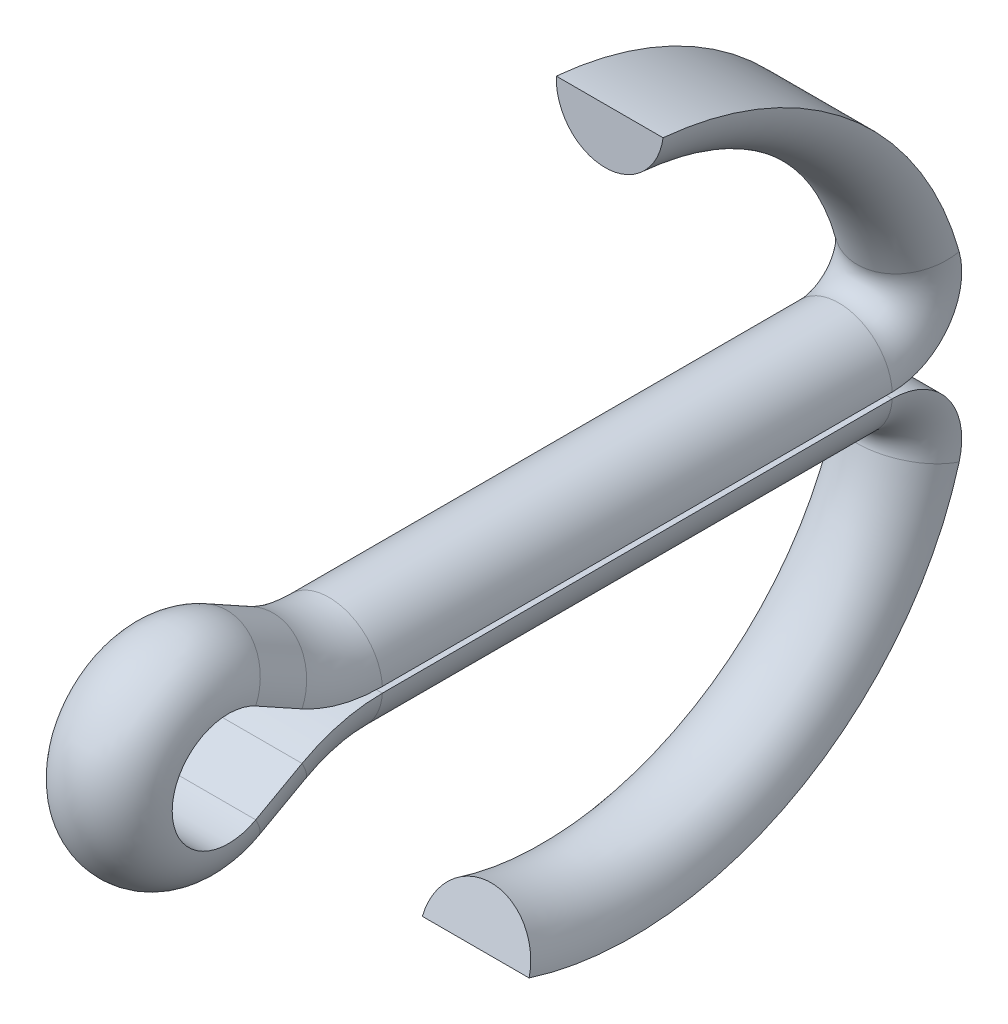
ISO-10303-21;
HEADER;
FILE_DESCRIPTION(('STEP AP214'),'2;1');
FILE_NAME('part.step','',(''),(''),'','','');
FILE_SCHEMA(('AUTOMOTIVE_DESIGN { 1 0 10303 214 1 1 1 1 }'));
ENDSEC;
DATA;
#1=APPLICATION_CONTEXT('core data for automotive mechanical design processes');
#2=APPLICATION_PROTOCOL_DEFINITION('international standard','automotive_design',2000,#1);
#3=PRODUCT_CONTEXT('',#1,'mechanical');
#4=PRODUCT('Part','Part','',(#3));
#5=PRODUCT_RELATED_PRODUCT_CATEGORY('part','',(#4));
#6=PRODUCT_DEFINITION_FORMATION('','',#4);
#7=PRODUCT_DEFINITION_CONTEXT('part definition',#1,'design');
#8=PRODUCT_DEFINITION('design','',#6,#7);
#9=PRODUCT_DEFINITION_SHAPE('','',#8);
#10=(LENGTH_UNIT() NAMED_UNIT(*) SI_UNIT(.MILLI.,.METRE.));
#11=(NAMED_UNIT(*) PLANE_ANGLE_UNIT() SI_UNIT($,.RADIAN.));
#12=(NAMED_UNIT(*) SI_UNIT($,.STERADIAN.) SOLID_ANGLE_UNIT());
#13=UNCERTAINTY_MEASURE_WITH_UNIT(LENGTH_MEASURE(1.E-05),#10,'distance_accuracy_value','');
#14=(GEOMETRIC_REPRESENTATION_CONTEXT(3) GLOBAL_UNCERTAINTY_ASSIGNED_CONTEXT((#13)) GLOBAL_UNIT_ASSIGNED_CONTEXT((#10,
#11,#12)) REPRESENTATION_CONTEXT('',''));
#15=CARTESIAN_POINT('',(0.,0.,0.));
#16=DIRECTION('',(0.,0.,1.));
#17=DIRECTION('',(1.,0.,0.));
#18=AXIS2_PLACEMENT_3D('',#15,#16,#17);
#19=CARTESIAN_POINT('',(0.,-0.00285714285714299,-36.3));
#20=DIRECTION('',(0.,0.,1.));
#21=DIRECTION('',(0.,-1.,0.));
#22=AXIS2_PLACEMENT_3D('',#19,#20,#21);
#23=CYLINDRICAL_SURFACE('',#22,1.85285714285714);
#24=DIRECTION('',(0.,0.,1.));
#25=VECTOR('',#24,1.);
#26=CARTESIAN_POINT('',(1.85,0.0999999999999996,-36.3));
#27=LINE('',#26,#25);
#28=CARTESIAN_POINT('',(1.85,0.0999999999999976,-23.));
#29=VERTEX_POINT('',#28);
#30=CARTESIAN_POINT('',(1.85,0.0999999999999959,-5.33243950141413));
#31=VERTEX_POINT('',#30);
#32=EDGE_CURVE('E242',#29,#31,#27,.T.);
#33=ORIENTED_EDGE('',*,*,#32,.F.);
#34=CARTESIAN_POINT('',(0.,-0.00285714285714457,-23.));
#35=DIRECTION('',(0.,0.,-1.));
#36=DIRECTION('',(-1.,0.,0.));
#37=AXIS2_PLACEMENT_3D('',#34,#35,#36);
#38=CIRCLE('',#37,1.85285714285714);
#39=CARTESIAN_POINT('',(-1.85,0.099999999999998,-23.));
#40=VERTEX_POINT('',#39);
#41=EDGE_CURVE('E246',#29,#40,#38,.F.);
#42=ORIENTED_EDGE('',*,*,#41,.T.);
#43=DIRECTION('',(0.,0.,1.));
#44=VECTOR('',#43,1.);
#45=CARTESIAN_POINT('',(-1.85,0.0999999999999996,-36.3));
#46=LINE('',#45,#44);
#47=CARTESIAN_POINT('',(-1.85,0.0999999999999959,-5.33243950141413));
#48=VERTEX_POINT('',#47);
#49=EDGE_CURVE('E171',#40,#48,#46,.T.);
#50=ORIENTED_EDGE('',*,*,#49,.T.);
#51=CARTESIAN_POINT('',(0.,-0.00285714285714667,-5.33243950141413));
#52=DIRECTION('',(0.,0.,1.));
#53=DIRECTION('',(-1.,0.,0.));
#54=AXIS2_PLACEMENT_3D('',#51,#52,#53);
#55=CIRCLE('',#54,1.85285714285714);
#56=EDGE_CURVE('E245',#31,#48,#55,.T.);
#57=ORIENTED_EDGE('',*,*,#56,.F.);
#58=EDGE_LOOP('',(#33,#42,#50,#57));
#59=FACE_BOUND('',#58,.T.);
#60=ADVANCED_FACE('F43',(#59),#23,.T.);
#61=CARTESIAN_POINT('',(-1.85,0.0999999999999996,-36.3));
#62=DIRECTION('',(0.,-1.,0.));
#63=DIRECTION('',(0.,0.,-1.));
#64=AXIS2_PLACEMENT_3D('',#61,#62,#63);
#65=PLANE('',#64);
#66=ORIENTED_EDGE('',*,*,#49,.F.);
#67=DIRECTION('',(1.,0.,0.));
#68=VECTOR('',#67,1.);
#69=CARTESIAN_POINT('',(-1.85,0.099999999999998,-23.));
#70=LINE('',#69,#68);
#71=EDGE_CURVE('E143',#40,#29,#70,.T.);
#72=ORIENTED_EDGE('',*,*,#71,.T.);
#73=ORIENTED_EDGE('',*,*,#32,.T.);
#74=DIRECTION('',(1.,0.,0.));
#75=VECTOR('',#74,1.);
#76=CARTESIAN_POINT('',(-1.85,0.0999999999999959,-5.33243950141413));
#77=LINE('',#76,#75);
#78=EDGE_CURVE('E166',#48,#31,#77,.T.);
#79=ORIENTED_EDGE('',*,*,#78,.F.);
#80=EDGE_LOOP('',(#66,#72,#73,#79));
#81=FACE_BOUND('',#80,.T.);
#82=ADVANCED_FACE('F330',(#81),#65,.T.);
#83=CARTESIAN_POINT('',(0.,0.0028571428571466,-5.33243950141412));
#84=DIRECTION('',(0.,0.,-1.));
#85=DIRECTION('',(0.,1.,0.));
#86=AXIS2_PLACEMENT_3D('',#83,#84,#85);
#87=CYLINDRICAL_SURFACE('',#86,1.85285714285714);
#88=DIRECTION('',(0.,0.,-1.));
#89=VECTOR('',#88,1.);
#90=CARTESIAN_POINT('',(-1.85,-0.099999999999996,-5.33243950141412));
#91=LINE('',#90,#89);
#92=CARTESIAN_POINT('',(-1.85,-0.0999999999999942,-5.33243950141413));
#93=VERTEX_POINT('',#92);
#94=CARTESIAN_POINT('',(-1.85,-0.0999999999999981,-23.));
#95=VERTEX_POINT('',#94);
#96=EDGE_CURVE('E52',#93,#95,#91,.T.);
#97=ORIENTED_EDGE('',*,*,#96,.T.);
#98=CARTESIAN_POINT('',(0.,0.00285714285714452,-23.));
#99=DIRECTION('',(0.,0.,-1.));
#100=DIRECTION('',(-1.,0.,0.));
#101=AXIS2_PLACEMENT_3D('',#98,#99,#100);
#102=CIRCLE('',#101,1.85285714285714);
#103=CARTESIAN_POINT('',(1.85,-0.0999999999999981,-23.));
#104=VERTEX_POINT('',#103);
#105=EDGE_CURVE('E133',#95,#104,#102,.F.);
#106=ORIENTED_EDGE('',*,*,#105,.T.);
#107=DIRECTION('',(0.,0.,-1.));
#108=VECTOR('',#107,1.);
#109=CARTESIAN_POINT('',(1.85,-0.099999999999996,-5.33243950141412));
#110=LINE('',#109,#108);
#111=CARTESIAN_POINT('',(1.85,-0.0999999999999942,-5.33243950141413));
#112=VERTEX_POINT('',#111);
#113=EDGE_CURVE('E65',#112,#104,#110,.T.);
#114=ORIENTED_EDGE('',*,*,#113,.F.);
#115=CARTESIAN_POINT('',(0.,0.00285714285714646,-5.33243950141413));
#116=DIRECTION('',(0.,0.,-1.));
#117=DIRECTION('',(-1.,0.,0.));
#118=AXIS2_PLACEMENT_3D('',#115,#116,#117);
#119=CIRCLE('',#118,1.85285714285714);
#120=EDGE_CURVE('E156',#112,#93,#119,.T.);
#121=ORIENTED_EDGE('',*,*,#120,.T.);
#122=EDGE_LOOP('',(#97,#106,#114,#121));
#123=FACE_BOUND('',#122,.T.);
#124=ADVANCED_FACE('F154',(#123),#87,.T.);
#125=CARTESIAN_POINT('',(-1.85,-0.099999999999996,-5.33243950141412));
#126=DIRECTION('',(0.,1.,0.));
#127=DIRECTION('',(0.,0.,1.));
#128=AXIS2_PLACEMENT_3D('',#125,#126,#127);
#129=PLANE('',#128);
#130=ORIENTED_EDGE('',*,*,#113,.T.);
#131=DIRECTION('',(-1.,0.,0.));
#132=VECTOR('',#131,1.);
#133=CARTESIAN_POINT('',(-1.85,-0.0999999999999981,-23.));
#134=LINE('',#133,#132);
#135=EDGE_CURVE('E11',#104,#95,#134,.T.);
#136=ORIENTED_EDGE('',*,*,#135,.T.);
#137=ORIENTED_EDGE('',*,*,#96,.F.);
#138=DIRECTION('',(1.,0.,0.));
#139=VECTOR('',#138,1.);
#140=CARTESIAN_POINT('',(-1.85,-0.0999999999999961,-5.33243950141413));
#141=LINE('',#140,#139);
#142=EDGE_CURVE('E160',#93,#112,#141,.T.);
#143=ORIENTED_EDGE('',*,*,#142,.T.);
#144=EDGE_LOOP('',(#130,#136,#137,#143));
#145=FACE_BOUND('',#144,.T.);
#146=ADVANCED_FACE('F45',(#145),#129,.T.);
#147=CARTESIAN_POINT('',(0.,5.85,-5.3324395014141));
#148=DIRECTION('',(-1.,0.,0.));
#149=DIRECTION('',(0.,0.,1.));
#150=AXIS2_PLACEMENT_3D('',#147,#148,#149);
#151=TOROIDAL_SURFACE('',#150,5.85285714285727,1.85285714285714);
#152=CARTESIAN_POINT('',(-1.85,5.85,-5.3324395014141));
#153=DIRECTION('',(-1.,0.,0.));
#154=DIRECTION('',(0.,-1.,0.));
#155=AXIS2_PLACEMENT_3D('',#152,#153,#154);
#156=CIRCLE('',#155,5.75000000000013);
#157=CARTESIAN_POINT('',(-1.85,0.818285453875234,-2.54957250381649));
#158=VERTEX_POINT('',#157);
#159=EDGE_CURVE('E177',#48,#158,#156,.T.);
#160=ORIENTED_EDGE('',*,*,#159,.T.);
#161=CARTESIAN_POINT('',(0.,0.72827714398194,-2.4997920258471));
#162=DIRECTION('',(0.,0.4839768691474,0.875080790630374));
#163=DIRECTION('',(-1.,0.,0.));
#164=AXIS2_PLACEMENT_3D('',#161,#162,#163);
#165=CIRCLE('',#164,1.85285714285714);
#166=CARTESIAN_POINT('',(1.85,0.818285453875234,-2.54957250381649));
#167=VERTEX_POINT('',#166);
#168=EDGE_CURVE('E235',#167,#158,#165,.T.);
#169=ORIENTED_EDGE('',*,*,#168,.F.);
#170=CARTESIAN_POINT('',(1.85,5.85,-5.3324395014141));
#171=DIRECTION('',(-1.,0.,0.));
#172=DIRECTION('',(0.,-1.,0.));
#173=AXIS2_PLACEMENT_3D('',#170,#171,#172);
#174=CIRCLE('',#173,5.75000000000013);
#175=EDGE_CURVE('E170',#31,#167,#174,.T.);
#176=ORIENTED_EDGE('',*,*,#175,.F.);
#177=ORIENTED_EDGE('',*,*,#56,.T.);
#178=EDGE_LOOP('',(#160,#169,#176,#177));
#179=FACE_BOUND('',#178,.T.);
#180=ADVANCED_FACE('F326',(#179),#151,.T.);
#181=CARTESIAN_POINT('',(0.,5.85,-5.3324395014141));
#182=DIRECTION('',(-1.,0.,0.));
#183=DIRECTION('',(0.,0.,1.));
#184=AXIS2_PLACEMENT_3D('',#181,#182,#183);
#185=CYLINDRICAL_SURFACE('',#184,5.75000000000013);
#186=DIRECTION('',(1.,0.,0.));
#187=VECTOR('',#186,1.);
#188=CARTESIAN_POINT('',(-1.85,0.818285453875349,-2.54957250381655));
#189=LINE('',#188,#187);
#190=EDGE_CURVE('E172',#158,#167,#189,.T.);
#191=ORIENTED_EDGE('',*,*,#190,.F.);
#192=ORIENTED_EDGE('',*,*,#159,.F.);
#193=ORIENTED_EDGE('',*,*,#78,.T.);
#194=ORIENTED_EDGE('',*,*,#175,.T.);
#195=EDGE_LOOP('',(#191,#192,#193,#194));
#196=FACE_BOUND('',#195,.T.);
#197=ADVANCED_FACE('F344',(#196),#185,.T.);
#198=CARTESIAN_POINT('',(0.,0.728277143981937,-2.4997920258471));
#199=DIRECTION('',(0.,0.483976869147397,0.875080790630375));
#200=DIRECTION('',(0.,-0.875080790630376,0.483976869147397));
#201=AXIS2_PLACEMENT_3D('',#198,#199,#200);
#202=CYLINDRICAL_SURFACE('',#201,1.85285714285714);
#203=DIRECTION('',(0.,0.483976869147397,0.875080790630375));
#204=VECTOR('',#203,1.);
#205=CARTESIAN_POINT('',(-1.85,0.818285453875345,-2.54957250381655));
#206=LINE('',#205,#204);
#207=CARTESIAN_POINT('',(-1.85,1.70640754172923,-0.943754894837419));
#208=VERTEX_POINT('',#207);
#209=EDGE_CURVE('E183',#158,#208,#206,.T.);
#210=ORIENTED_EDGE('',*,*,#209,.T.);
#211=CARTESIAN_POINT('',(0.,1.61639923183582,-0.89397441686797));
#212=DIRECTION('',(0.,0.483976869147397,0.875080790630375));
#213=DIRECTION('',(-1.,0.,0.));
#214=AXIS2_PLACEMENT_3D('',#211,#212,#213);
#215=CIRCLE('',#214,1.85285714285714);
#216=CARTESIAN_POINT('',(1.85,1.70640754172923,-0.943754894837419));
#217=VERTEX_POINT('',#216);
#218=EDGE_CURVE('E225',#217,#208,#215,.T.);
#219=ORIENTED_EDGE('',*,*,#218,.F.);
#220=DIRECTION('',(0.,0.483976869147397,0.875080790630375));
#221=VECTOR('',#220,1.);
#222=CARTESIAN_POINT('',(1.85,0.818285453875345,-2.54957250381655));
#223=LINE('',#222,#221);
#224=EDGE_CURVE('E176',#167,#217,#223,.T.);
#225=ORIENTED_EDGE('',*,*,#224,.F.);
#226=ORIENTED_EDGE('',*,*,#168,.T.);
#227=EDGE_LOOP('',(#210,#219,#225,#226));
#228=FACE_BOUND('',#227,.T.);
#229=ADVANCED_FACE('F346',(#228),#202,.T.);
#230=CARTESIAN_POINT('',(-1.85,0.818285453875345,-2.54957250381655));
#231=DIRECTION('',(0.,-0.875080790630375,0.483976869147397));
#232=DIRECTION('',(0.,-0.483976869147397,-0.875080790630375));
#233=AXIS2_PLACEMENT_3D('',#230,#231,#232);
#234=PLANE('',#233);
#235=DIRECTION('',(1.,0.,0.));
#236=VECTOR('',#235,1.);
#237=CARTESIAN_POINT('',(-1.85,1.70640754172923,-0.943754894837417));
#238=LINE('',#237,#236);
#239=EDGE_CURVE('E178',#208,#217,#238,.T.);
#240=ORIENTED_EDGE('',*,*,#239,.F.);
#241=ORIENTED_EDGE('',*,*,#209,.F.);
#242=ORIENTED_EDGE('',*,*,#190,.T.);
#243=ORIENTED_EDGE('',*,*,#224,.T.);
#244=EDGE_LOOP('',(#240,#241,#242,#243));
#245=FACE_BOUND('',#244,.T.);
#246=ADVANCED_FACE('F349',(#245),#234,.T.);
#247=CARTESIAN_POINT('',(0.,0.,0.));
#248=DIRECTION('',(1.,0.,0.));
#249=DIRECTION('',(0.,0.,-1.));
#250=AXIS2_PLACEMENT_3D('',#247,#248,#249);
#251=DEGENERATE_TOROIDAL_SURFACE('',#250,1.84714285714285,1.85285714285714,.T.);
#252=CARTESIAN_POINT('',(-1.85,0.,0.));
#253=DIRECTION('',(1.,0.,0.));
#254=DIRECTION('',(0.,0.875080790630376,-0.483976869147396));
#255=AXIS2_PLACEMENT_3D('',#252,#253,#254);
#256=CIRCLE('',#255,1.95);
#257=CARTESIAN_POINT('',(-1.85,-1.70640754172923,-0.94375489483742));
#258=VERTEX_POINT('',#257);
#259=EDGE_CURVE('E189',#208,#258,#256,.T.);
#260=ORIENTED_EDGE('',*,*,#259,.T.);
#261=CARTESIAN_POINT('',(0.,-1.61639923183582,-0.89397441686797));
#262=DIRECTION('',(0.,0.483976869147396,-0.875080790630376));
#263=DIRECTION('',(-1.,0.,0.));
#264=AXIS2_PLACEMENT_3D('',#261,#262,#263);
#265=CIRCLE('',#264,1.85285714285714);
#266=CARTESIAN_POINT('',(1.85,-1.70640754172923,-0.94375489483742));
#267=VERTEX_POINT('',#266);
#268=EDGE_CURVE('E215',#267,#258,#265,.T.);
#269=ORIENTED_EDGE('',*,*,#268,.F.);
#270=CARTESIAN_POINT('',(1.85,0.,0.));
#271=DIRECTION('',(1.,0.,0.));
#272=DIRECTION('',(0.,0.875080790630376,-0.483976869147396));
#273=AXIS2_PLACEMENT_3D('',#270,#271,#272);
#274=CIRCLE('',#273,1.95);
#275=EDGE_CURVE('E182',#217,#267,#274,.T.);
#276=ORIENTED_EDGE('',*,*,#275,.F.);
#277=ORIENTED_EDGE('',*,*,#218,.T.);
#278=EDGE_LOOP('',(#260,#269,#276,#277));
#279=FACE_BOUND('',#278,.T.);
#280=ADVANCED_FACE('F351',(#279),#251,.T.);
#281=CARTESIAN_POINT('',(0.,0.,0.));
#282=DIRECTION('',(1.,0.,0.));
#283=DIRECTION('',(0.,0.,-1.));
#284=AXIS2_PLACEMENT_3D('',#281,#282,#283);
#285=CYLINDRICAL_SURFACE('',#284,1.95);
#286=DIRECTION('',(1.,0.,0.));
#287=VECTOR('',#286,1.);
#288=CARTESIAN_POINT('',(-1.85,-1.70640754172923,-0.943754894837417));
#289=LINE('',#288,#287);
#290=EDGE_CURVE('E184',#258,#267,#289,.T.);
#291=ORIENTED_EDGE('',*,*,#290,.F.);
#292=ORIENTED_EDGE('',*,*,#259,.F.);
#293=ORIENTED_EDGE('',*,*,#239,.T.);
#294=ORIENTED_EDGE('',*,*,#275,.T.);
#295=EDGE_LOOP('',(#291,#292,#293,#294));
#296=FACE_BOUND('',#295,.T.);
#297=ADVANCED_FACE('F354',(#296),#285,.F.);
#298=CARTESIAN_POINT('',(0.,-1.61639923183583,-0.893974416867976));
#299=DIRECTION('',(0.,0.483976869147397,-0.875080790630375));
#300=DIRECTION('',(0.,0.875080790630376,0.483976869147397));
#301=AXIS2_PLACEMENT_3D('',#298,#299,#300);
#302=CYLINDRICAL_SURFACE('',#301,1.85285714285714);
#303=DIRECTION('',(0.,0.483976869147397,-0.875080790630375));
#304=VECTOR('',#303,1.);
#305=CARTESIAN_POINT('',(-1.85,-1.70640754172923,-0.943754894837424));
#306=LINE('',#305,#304);
#307=CARTESIAN_POINT('',(-1.85,-0.818285453875346,-2.54957250381656));
#308=VERTEX_POINT('',#307);
#309=EDGE_CURVE('E193',#258,#308,#306,.T.);
#310=ORIENTED_EDGE('',*,*,#309,.T.);
#311=CARTESIAN_POINT('',(0.,-0.728277143981937,-2.49979202584711));
#312=DIRECTION('',(0.,0.483976869147397,-0.875080790630375));
#313=DIRECTION('',(-1.,0.,0.));
#314=AXIS2_PLACEMENT_3D('',#311,#312,#313);
#315=CIRCLE('',#314,1.85285714285714);
#316=CARTESIAN_POINT('',(1.85,-0.818285453875346,-2.54957250381656));
#317=VERTEX_POINT('',#316);
#318=EDGE_CURVE('E206',#317,#308,#315,.T.);
#319=ORIENTED_EDGE('',*,*,#318,.F.);
#320=DIRECTION('',(0.,0.483976869147397,-0.875080790630375));
#321=VECTOR('',#320,1.);
#322=CARTESIAN_POINT('',(1.85,-1.70640754172923,-0.943754894837424));
#323=LINE('',#322,#321);
#324=EDGE_CURVE('E188',#267,#317,#323,.T.);
#325=ORIENTED_EDGE('',*,*,#324,.F.);
#326=ORIENTED_EDGE('',*,*,#268,.T.);
#327=EDGE_LOOP('',(#310,#319,#325,#326));
#328=FACE_BOUND('',#327,.T.);
#329=ADVANCED_FACE('F356',(#328),#302,.T.);
#330=CARTESIAN_POINT('',(-1.85,-1.70640754172923,-0.943754894837424));
#331=DIRECTION('',(0.,0.875080790630375,0.483976869147397));
#332=DIRECTION('',(0.,-0.483976869147397,0.875080790630375));
#333=AXIS2_PLACEMENT_3D('',#330,#331,#332);
#334=PLANE('',#333);
#335=DIRECTION('',(1.,0.,0.));
#336=VECTOR('',#335,1.);
#337=CARTESIAN_POINT('',(-1.85,-0.818285453875345,-2.54957250381656));
#338=LINE('',#337,#336);
#339=EDGE_CURVE('E190',#308,#317,#338,.T.);
#340=ORIENTED_EDGE('',*,*,#339,.F.);
#341=ORIENTED_EDGE('',*,*,#309,.F.);
#342=ORIENTED_EDGE('',*,*,#290,.T.);
#343=ORIENTED_EDGE('',*,*,#324,.T.);
#344=EDGE_LOOP('',(#340,#341,#342,#343));
#345=FACE_BOUND('',#344,.T.);
#346=ADVANCED_FACE('F359',(#345),#334,.T.);
#347=CARTESIAN_POINT('',(0.,-5.85,-5.3324395014141));
#348=DIRECTION('',(-1.,0.,0.));
#349=DIRECTION('',(0.,0.,1.));
#350=AXIS2_PLACEMENT_3D('',#347,#348,#349);
#351=TOROIDAL_SURFACE('',#350,5.85285714285714,1.85285714285714);
#352=CARTESIAN_POINT('',(-1.85,-5.85,-5.3324395014141));
#353=DIRECTION('',(-1.,0.,0.));
#354=DIRECTION('',(0.,0.875080790630374,0.4839768691474));
#355=AXIS2_PLACEMENT_3D('',#352,#353,#354);
#356=CIRCLE('',#355,5.75);
#357=EDGE_CURVE('E195',#308,#93,#356,.T.);
#358=ORIENTED_EDGE('',*,*,#357,.T.);
#359=ORIENTED_EDGE('',*,*,#120,.F.);
#360=CARTESIAN_POINT('',(1.85,-5.85,-5.3324395014141));
#361=DIRECTION('',(-1.,0.,0.));
#362=DIRECTION('',(0.,0.875080790630374,0.4839768691474));
#363=AXIS2_PLACEMENT_3D('',#360,#361,#362);
#364=CIRCLE('',#363,5.75);
#365=EDGE_CURVE('E163',#317,#112,#364,.T.);
#366=ORIENTED_EDGE('',*,*,#365,.F.);
#367=ORIENTED_EDGE('',*,*,#318,.T.);
#368=EDGE_LOOP('',(#358,#359,#366,#367));
#369=FACE_BOUND('',#368,.T.);
#370=ADVANCED_FACE('F361',(#369),#351,.T.);
#371=CARTESIAN_POINT('',(0.,-5.85,-5.3324395014141));
#372=DIRECTION('',(-1.,0.,0.));
#373=DIRECTION('',(0.,0.,1.));
#374=AXIS2_PLACEMENT_3D('',#371,#372,#373);
#375=CYLINDRICAL_SURFACE('',#374,5.75);
#376=ORIENTED_EDGE('',*,*,#142,.F.);
#377=ORIENTED_EDGE('',*,*,#357,.F.);
#378=ORIENTED_EDGE('',*,*,#339,.T.);
#379=ORIENTED_EDGE('',*,*,#365,.T.);
#380=EDGE_LOOP('',(#376,#377,#378,#379));
#381=FACE_BOUND('',#380,.T.);
#382=ADVANCED_FACE('F364',(#381),#375,.T.);
#383=CARTESIAN_POINT('',(0.,11.8046700331032,-15.0677021394259));
#384=DIRECTION('',(0.,0.0900797273229016,0.995934557451157));
#385=DIRECTION('',(-1.,0.,0.));
#386=AXIS2_PLACEMENT_3D('',#383,#384,#385);
#387=PLANE('',#386);
#388=CARTESIAN_POINT('',(0.,11.8046700331032,-15.0677021394259));
#389=DIRECTION('',(0.,0.0900797273229016,0.995934557451157));
#390=DIRECTION('',(-1.,0.,0.));
#391=AXIS2_PLACEMENT_3D('',#388,#389,#390);
#392=CIRCLE('',#391,1.85285714285714);
#393=CARTESIAN_POINT('',(-1.85,11.7022310500511,-15.0584367960441));
#394=VERTEX_POINT('',#393);
#395=CARTESIAN_POINT('',(1.85,11.7022310500511,-15.0584367960441));
#396=VERTEX_POINT('',#395);
#397=EDGE_CURVE('E269',#394,#396,#392,.T.);
#398=ORIENTED_EDGE('',*,*,#397,.T.);
#399=DIRECTION('',(-1.,0.,0.));
#400=VECTOR('',#399,1.);
#401=CARTESIAN_POINT('',(1.85,11.7022310500511,-15.0584367960441));
#402=LINE('',#401,#400);
#403=EDGE_CURVE('E264',#396,#394,#402,.T.);
#404=ORIENTED_EDGE('',*,*,#403,.T.);
#405=EDGE_LOOP('',(#398,#404));
#406=FACE_BOUND('',#405,.T.);
#407=ADVANCED_FACE('F341',(#406),#387,.T.);
#408=CARTESIAN_POINT('',(0.,0.,-14.));
#409=DIRECTION('',(-1.,0.,0.));
#410=DIRECTION('',(0.,0.,1.));
#411=AXIS2_PLACEMENT_3D('',#408,#409,#410);
#412=TOROIDAL_SURFACE('',#411,11.8528571428571,1.85285714285714);
#413=CARTESIAN_POINT('',(1.85,0.,-14.));
#414=DIRECTION('',(-1.,0.,0.));
#415=DIRECTION('',(0.,0.995934557451157,-0.0900797273229021));
#416=AXIS2_PLACEMENT_3D('',#413,#414,#415);
#417=CIRCLE('',#416,11.75);
#418=CARTESIAN_POINT('',(1.85,3.15331267147646,-25.3189716492226));
#419=VERTEX_POINT('',#418);
#420=EDGE_CURVE('E263',#396,#419,#417,.T.);
#421=ORIENTED_EDGE('',*,*,#420,.F.);
#422=ORIENTED_EDGE('',*,*,#397,.F.);
#423=CARTESIAN_POINT('',(-1.85,0.,-14.));
#424=DIRECTION('',(-1.,0.,0.));
#425=DIRECTION('',(0.,0.995934557451157,-0.0900797273229021));
#426=AXIS2_PLACEMENT_3D('',#423,#424,#425);
#427=CIRCLE('',#426,11.75);
#428=CARTESIAN_POINT('',(-1.85,3.15331267147646,-25.3189716492226));
#429=VERTEX_POINT('',#428);
#430=EDGE_CURVE('E268',#394,#429,#427,.T.);
#431=ORIENTED_EDGE('',*,*,#430,.T.);
#432=CARTESIAN_POINT('',(0.,3.18091613802312,-25.4180556563648));
#433=DIRECTION('',(0.,0.963316736104055,0.268367035870337));
#434=DIRECTION('',(-1.,0.,0.));
#435=AXIS2_PLACEMENT_3D('',#432,#433,#434);
#436=CIRCLE('',#435,1.85285714285714);
#437=EDGE_CURVE('E278',#429,#419,#436,.T.);
#438=ORIENTED_EDGE('',*,*,#437,.T.);
#439=EDGE_LOOP('',(#421,#422,#431,#438));
#440=FACE_BOUND('',#439,.T.);
#441=ADVANCED_FACE('F383',(#440),#412,.T.);
#442=CARTESIAN_POINT('',(0.,0.,-14.));
#443=DIRECTION('',(-1.,0.,0.));
#444=DIRECTION('',(0.,0.,1.));
#445=AXIS2_PLACEMENT_3D('',#442,#443,#444);
#446=CYLINDRICAL_SURFACE('',#445,11.75);
#447=DIRECTION('',(-1.,0.,0.));
#448=VECTOR('',#447,1.);
#449=CARTESIAN_POINT('',(1.85,3.15331267147646,-25.3189716492226));
#450=LINE('',#449,#448);
#451=EDGE_CURVE('E258',#419,#429,#450,.T.);
#452=ORIENTED_EDGE('',*,*,#451,.T.);
#453=ORIENTED_EDGE('',*,*,#430,.F.);
#454=ORIENTED_EDGE('',*,*,#403,.F.);
#455=ORIENTED_EDGE('',*,*,#420,.T.);
#456=EDGE_LOOP('',(#452,#453,#454,#455));
#457=FACE_BOUND('',#456,.T.);
#458=ADVANCED_FACE('F456',(#457),#446,.T.);
#459=CARTESIAN_POINT('',(0.,2.50727848101265,-23.));
#460=DIRECTION('',(-1.,0.,0.));
#461=DIRECTION('',(0.,0.,1.));
#462=AXIS2_PLACEMENT_3D('',#459,#460,#461);
#463=TOROIDAL_SURFACE('',#462,2.51013562386979,1.85285714285714);
#464=CARTESIAN_POINT('',(1.85,2.50727848101265,-23.));
#465=DIRECTION('',(-1.,0.,0.));
#466=DIRECTION('',(0.,0.268367035870333,-0.963316736104056));
#467=AXIS2_PLACEMENT_3D('',#464,#465,#466);
#468=CIRCLE('',#467,2.40727848101265);
#469=EDGE_CURVE('E144',#419,#29,#468,.T.);
#470=ORIENTED_EDGE('',*,*,#469,.F.);
#471=ORIENTED_EDGE('',*,*,#437,.F.);
#472=CARTESIAN_POINT('',(-1.85,2.50727848101265,-23.));
#473=DIRECTION('',(-1.,0.,0.));
#474=DIRECTION('',(0.,0.268367035870333,-0.963316736104056));
#475=AXIS2_PLACEMENT_3D('',#472,#473,#474);
#476=CIRCLE('',#475,2.40727848101265);
#477=EDGE_CURVE('E262',#429,#40,#476,.T.);
#478=ORIENTED_EDGE('',*,*,#477,.T.);
#479=ORIENTED_EDGE('',*,*,#41,.F.);
#480=EDGE_LOOP('',(#470,#471,#478,#479));
#481=FACE_BOUND('',#480,.T.);
#482=ADVANCED_FACE('F323',(#481),#463,.T.);
#483=CARTESIAN_POINT('',(0.,2.50727848101265,-23.));
#484=DIRECTION('',(-1.,0.,0.));
#485=DIRECTION('',(0.,0.,1.));
#486=AXIS2_PLACEMENT_3D('',#483,#484,#485);
#487=CYLINDRICAL_SURFACE('',#486,2.40727848101265);
#488=ORIENTED_EDGE('',*,*,#71,.F.);
#489=ORIENTED_EDGE('',*,*,#477,.F.);
#490=ORIENTED_EDGE('',*,*,#451,.F.);
#491=ORIENTED_EDGE('',*,*,#469,.T.);
#492=EDGE_LOOP('',(#488,#489,#490,#491));
#493=FACE_BOUND('',#492,.T.);
#494=ADVANCED_FACE('F316',(#493),#487,.T.);
#495=CARTESIAN_POINT('',(0.,-11.2886039117807,-10.386463758047));
#496=DIRECTION('',(0.,0.304866261222988,0.952395171537486));
#497=DIRECTION('',(-1.,0.,0.));
#498=AXIS2_PLACEMENT_3D('',#495,#496,#497);
#499=PLANE('',#498);
#500=CARTESIAN_POINT('',(0.,-11.2886039117807,-10.386463758047));
#501=DIRECTION('',(0.,0.304866261222988,0.952395171537486));
#502=DIRECTION('',(-1.,0.,0.));
#503=AXIS2_PLACEMENT_3D('',#500,#501,#502);
#504=CIRCLE('',#503,1.85285714285714);
#505=CARTESIAN_POINT('',(1.85,-11.1906432655655,-10.4178214306299));
#506=VERTEX_POINT('',#505);
#507=CARTESIAN_POINT('',(-1.85,-11.1906432655655,-10.4178214306299));
#508=VERTEX_POINT('',#507);
#509=EDGE_CURVE('E298',#506,#508,#504,.T.);
#510=ORIENTED_EDGE('',*,*,#509,.T.);
#511=DIRECTION('',(1.,0.,0.));
#512=VECTOR('',#511,1.);
#513=CARTESIAN_POINT('',(-1.85,-11.1906432655655,-10.4178214306299));
#514=LINE('',#513,#512);
#515=EDGE_CURVE('E288',#508,#506,#514,.T.);
#516=ORIENTED_EDGE('',*,*,#515,.T.);
#517=EDGE_LOOP('',(#510,#516));
#518=FACE_BOUND('',#517,.T.);
#519=ADVANCED_FACE('F314',(#518),#499,.T.);
#520=CARTESIAN_POINT('',(0.,-2.50727848101265,-23.));
#521=DIRECTION('',(-1.,0.,0.));
#522=DIRECTION('',(0.,0.,1.));
#523=AXIS2_PLACEMENT_3D('',#520,#521,#522);
#524=TOROIDAL_SURFACE('',#523,2.51013562386979,1.85285714285714);
#525=CARTESIAN_POINT('',(-1.85,-2.50727848101265,-23.));
#526=DIRECTION('',(-1.,0.,0.));
#527=DIRECTION('',(0.,1.,0.));
#528=AXIS2_PLACEMENT_3D('',#525,#526,#527);
#529=CIRCLE('',#528,2.40727848101265);
#530=CARTESIAN_POINT('',(-1.85,-3.15331267147647,-25.3189716492226));
#531=VERTEX_POINT('',#530);
#532=EDGE_CURVE('E137',#95,#531,#529,.T.);
#533=ORIENTED_EDGE('',*,*,#532,.T.);
#534=CARTESIAN_POINT('',(0.,-3.18091613802313,-25.4180556563648));
#535=DIRECTION('',(0.,-0.963316736104054,0.268367035870341));
#536=DIRECTION('',(-1.,0.,0.));
#537=AXIS2_PLACEMENT_3D('',#534,#535,#536);
#538=CIRCLE('',#537,1.85285714285714);
#539=CARTESIAN_POINT('',(1.85,-3.15331267147647,-25.3189716492226));
#540=VERTEX_POINT('',#539);
#541=EDGE_CURVE('E152',#540,#531,#538,.T.);
#542=ORIENTED_EDGE('',*,*,#541,.F.);
#543=CARTESIAN_POINT('',(1.85,-2.50727848101265,-23.));
#544=DIRECTION('',(-1.,0.,0.));
#545=DIRECTION('',(0.,1.,0.));
#546=AXIS2_PLACEMENT_3D('',#543,#544,#545);
#547=CIRCLE('',#546,2.40727848101265);
#548=EDGE_CURVE('E140',#104,#540,#547,.T.);
#549=ORIENTED_EDGE('',*,*,#548,.F.);
#550=ORIENTED_EDGE('',*,*,#105,.F.);
#551=EDGE_LOOP('',(#533,#542,#549,#550));
#552=FACE_BOUND('',#551,.T.);
#553=ADVANCED_FACE('F135',(#552),#524,.T.);
#554=CARTESIAN_POINT('',(0.,-2.50727848101265,-23.));
#555=DIRECTION('',(-1.,0.,0.));
#556=DIRECTION('',(0.,0.,1.));
#557=AXIS2_PLACEMENT_3D('',#554,#555,#556);
#558=CYLINDRICAL_SURFACE('',#557,2.40727848101265);
#559=DIRECTION('',(1.,0.,0.));
#560=VECTOR('',#559,1.);
#561=CARTESIAN_POINT('',(-1.85,-3.15331267147647,-25.3189716492226));
#562=LINE('',#561,#560);
#563=EDGE_CURVE('E150',#531,#540,#562,.T.);
#564=ORIENTED_EDGE('',*,*,#563,.F.);
#565=ORIENTED_EDGE('',*,*,#532,.F.);
#566=ORIENTED_EDGE('',*,*,#135,.F.);
#567=ORIENTED_EDGE('',*,*,#548,.T.);
#568=EDGE_LOOP('',(#564,#565,#566,#567));
#569=FACE_BOUND('',#568,.T.);
#570=ADVANCED_FACE('F148',(#569),#558,.T.);
#571=CARTESIAN_POINT('',(0.,0.,-14.));
#572=DIRECTION('',(-1.,0.,0.));
#573=DIRECTION('',(0.,0.,1.));
#574=AXIS2_PLACEMENT_3D('',#571,#572,#573);
#575=TOROIDAL_SURFACE('',#574,11.8528571428571,1.85285714285714);
#576=CARTESIAN_POINT('',(-1.85,0.,-14.));
#577=DIRECTION('',(-1.,0.,0.));
#578=DIRECTION('',(0.,-0.268367035870337,-0.963316736104055));
#579=AXIS2_PLACEMENT_3D('',#576,#577,#578);
#580=CIRCLE('',#579,11.75);
#581=EDGE_CURVE('E291',#531,#508,#580,.T.);
#582=ORIENTED_EDGE('',*,*,#581,.T.);
#583=ORIENTED_EDGE('',*,*,#509,.F.);
#584=CARTESIAN_POINT('',(1.85,0.,-14.));
#585=DIRECTION('',(-1.,0.,0.));
#586=DIRECTION('',(0.,-0.268367035870337,-0.963316736104055));
#587=AXIS2_PLACEMENT_3D('',#584,#585,#586);
#588=CIRCLE('',#587,11.75);
#589=EDGE_CURVE('E294',#540,#506,#588,.T.);
#590=ORIENTED_EDGE('',*,*,#589,.F.);
#591=ORIENTED_EDGE('',*,*,#541,.T.);
#592=EDGE_LOOP('',(#582,#583,#590,#591));
#593=FACE_BOUND('',#592,.T.);
#594=ADVANCED_FACE('F308',(#593),#575,.T.);
#595=CARTESIAN_POINT('',(0.,0.,-14.));
#596=DIRECTION('',(-1.,0.,0.));
#597=DIRECTION('',(0.,0.,1.));
#598=AXIS2_PLACEMENT_3D('',#595,#596,#597);
#599=CYLINDRICAL_SURFACE('',#598,11.75);
#600=ORIENTED_EDGE('',*,*,#515,.F.);
#601=ORIENTED_EDGE('',*,*,#581,.F.);
#602=ORIENTED_EDGE('',*,*,#563,.T.);
#603=ORIENTED_EDGE('',*,*,#589,.T.);
#604=EDGE_LOOP('',(#600,#601,#602,#603));
#605=FACE_BOUND('',#604,.T.);
#606=ADVANCED_FACE('F312',(#605),#599,.T.);
#607=CLOSED_SHELL('',(#60,#82,#124,#146,#180,#197,#229,#246,#280,#297,#329,#346,#370,#382,#407,
#441,#458,#482,#494,#519,#553,#570,#594,#606));
#608=MANIFOLD_SOLID_BREP('B2',#607);
#609=ADVANCED_BREP_SHAPE_REPRESENTATION('',(#18,#608),#14);
#610=SHAPE_DEFINITION_REPRESENTATION(#9,#609);
ENDSEC;
END-ISO-10303-21;
